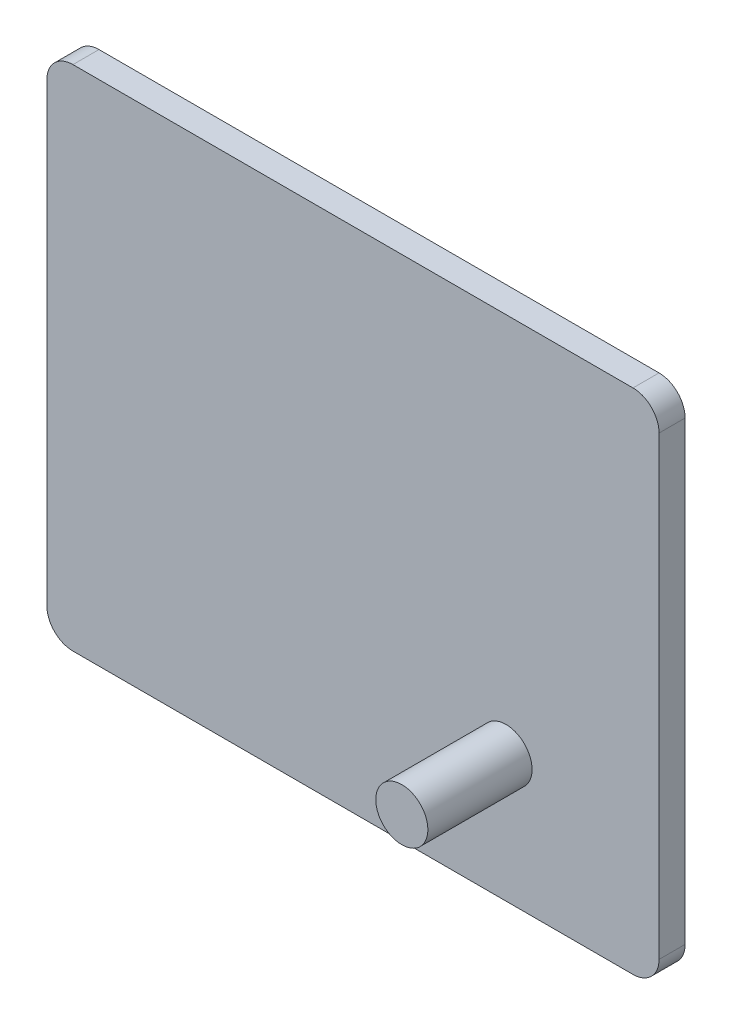
ISO-10303-21;
HEADER;
FILE_DESCRIPTION(('STEP AP214'),'2;1');
FILE_NAME('part.step','',(''),(''),'','','');
FILE_SCHEMA(('AUTOMOTIVE_DESIGN { 1 0 10303 214 1 1 1 1 }'));
ENDSEC;
DATA;
#1=APPLICATION_CONTEXT('core data for automotive mechanical design processes');
#2=APPLICATION_PROTOCOL_DEFINITION('international standard','automotive_design',2000,#1);
#3=PRODUCT_CONTEXT('',#1,'mechanical');
#4=PRODUCT('Part','Part','',(#3));
#5=PRODUCT_RELATED_PRODUCT_CATEGORY('part','',(#4));
#6=PRODUCT_DEFINITION_FORMATION('','',#4);
#7=PRODUCT_DEFINITION_CONTEXT('part definition',#1,'design');
#8=PRODUCT_DEFINITION('design','',#6,#7);
#9=PRODUCT_DEFINITION_SHAPE('','',#8);
#10=(LENGTH_UNIT() NAMED_UNIT(*) SI_UNIT(.MILLI.,.METRE.));
#11=(NAMED_UNIT(*) PLANE_ANGLE_UNIT() SI_UNIT($,.RADIAN.));
#12=(NAMED_UNIT(*) SI_UNIT($,.STERADIAN.) SOLID_ANGLE_UNIT());
#13=UNCERTAINTY_MEASURE_WITH_UNIT(LENGTH_MEASURE(1.E-05),#10,'distance_accuracy_value','');
#14=(GEOMETRIC_REPRESENTATION_CONTEXT(3) GLOBAL_UNCERTAINTY_ASSIGNED_CONTEXT((#13)) GLOBAL_UNIT_ASSIGNED_CONTEXT((#10,
#11,#12)) REPRESENTATION_CONTEXT('',''));
#15=CARTESIAN_POINT('',(0.,0.,0.));
#16=DIRECTION('',(0.,0.,1.));
#17=DIRECTION('',(1.,0.,0.));
#18=AXIS2_PLACEMENT_3D('',#15,#16,#17);
#19=CARTESIAN_POINT('',(0.,0.,13.5));
#20=DIRECTION('',(0.,0.,1.));
#21=DIRECTION('',(1.,0.,0.));
#22=AXIS2_PLACEMENT_3D('',#19,#20,#21);
#23=PLANE('',#22);
#24=DIRECTION('',(-1.,0.,0.));
#25=VECTOR('',#24,1.);
#26=CARTESIAN_POINT('',(5.375,4.875,13.5));
#27=LINE('',#26,#25);
#28=CARTESIAN_POINT('',(5.375,4.875,13.5));
#29=VERTEX_POINT('',#28);
#30=CARTESIAN_POINT('',(-5.375,4.875,13.5));
#31=VERTEX_POINT('',#30);
#32=EDGE_CURVE('E26',#29,#31,#27,.T.);
#33=ORIENTED_EDGE('',*,*,#32,.F.);
#34=CARTESIAN_POINT('',(5.375,4.375,13.5));
#35=DIRECTION('',(0.,0.,1.));
#36=DIRECTION('',(1.,0.,0.));
#37=AXIS2_PLACEMENT_3D('',#34,#35,#36);
#38=CIRCLE('',#37,0.5);
#39=CARTESIAN_POINT('',(5.875,4.375,13.5));
#40=VERTEX_POINT('',#39);
#41=EDGE_CURVE('E142',#40,#29,#38,.T.);
#42=ORIENTED_EDGE('',*,*,#41,.F.);
#43=DIRECTION('',(0.,1.,0.));
#44=VECTOR('',#43,1.);
#45=CARTESIAN_POINT('',(5.875,-4.375,13.5));
#46=LINE('',#45,#44);
#47=CARTESIAN_POINT('',(5.875,-4.375,13.5));
#48=VERTEX_POINT('',#47);
#49=EDGE_CURVE('E123',#48,#40,#46,.T.);
#50=ORIENTED_EDGE('',*,*,#49,.F.);
#51=CARTESIAN_POINT('',(5.375,-4.375,13.5));
#52=DIRECTION('',(0.,0.,1.));
#53=DIRECTION('',(0.,-1.,0.));
#54=AXIS2_PLACEMENT_3D('',#51,#52,#53);
#55=CIRCLE('',#54,0.5);
#56=CARTESIAN_POINT('',(5.375,-4.875,13.5));
#57=VERTEX_POINT('',#56);
#58=EDGE_CURVE('E163',#57,#48,#55,.T.);
#59=ORIENTED_EDGE('',*,*,#58,.F.);
#60=DIRECTION('',(1.,0.,0.));
#61=VECTOR('',#60,1.);
#62=CARTESIAN_POINT('',(-5.375,-4.875,13.5));
#63=LINE('',#62,#61);
#64=CARTESIAN_POINT('',(-5.375,-4.875,13.5));
#65=VERTEX_POINT('',#64);
#66=EDGE_CURVE('E159',#65,#57,#63,.T.);
#67=ORIENTED_EDGE('',*,*,#66,.F.);
#68=CARTESIAN_POINT('',(-5.375,-4.375,13.5));
#69=DIRECTION('',(0.,0.,1.));
#70=DIRECTION('',(-1.,0.,0.));
#71=AXIS2_PLACEMENT_3D('',#68,#69,#70);
#72=CIRCLE('',#71,0.5);
#73=CARTESIAN_POINT('',(-5.875,-4.375,13.5));
#74=VERTEX_POINT('',#73);
#75=EDGE_CURVE('E153',#74,#65,#72,.T.);
#76=ORIENTED_EDGE('',*,*,#75,.F.);
#77=DIRECTION('',(0.,-1.,0.));
#78=VECTOR('',#77,1.);
#79=CARTESIAN_POINT('',(-5.875,4.375,13.5));
#80=LINE('',#79,#78);
#81=CARTESIAN_POINT('',(-5.875,4.375,13.5));
#82=VERTEX_POINT('',#81);
#83=EDGE_CURVE('E174',#82,#74,#80,.T.);
#84=ORIENTED_EDGE('',*,*,#83,.F.);
#85=CARTESIAN_POINT('',(-5.375,4.375,13.5));
#86=DIRECTION('',(0.,0.,1.));
#87=DIRECTION('',(0.,1.,0.));
#88=AXIS2_PLACEMENT_3D('',#85,#86,#87);
#89=CIRCLE('',#88,0.5);
#90=EDGE_CURVE('E409',#31,#82,#89,.T.);
#91=ORIENTED_EDGE('',*,*,#90,.F.);
#92=EDGE_LOOP('',(#33,#42,#50,#59,#67,#76,#84,#91));
#93=FACE_BOUND('',#92,.T.);
#94=ADVANCED_FACE('F16',(#93),#23,.F.);
#95=CARTESIAN_POINT('',(0.,0.,14.));
#96=DIRECTION('',(0.,0.,1.));
#97=DIRECTION('',(1.,0.,0.));
#98=AXIS2_PLACEMENT_3D('',#95,#96,#97);
#99=PLANE('',#98);
#100=CARTESIAN_POINT('',(2.9375,-2.4375,14.));
#101=DIRECTION('',(0.,0.,-1.));
#102=DIRECTION('',(1.,0.,0.));
#103=AXIS2_PLACEMENT_3D('',#100,#101,#102);
#104=CIRCLE('',#103,0.5);
#105=CARTESIAN_POINT('',(3.4375,-2.4375,14.));
#106=VERTEX_POINT('',#105);
#107=CARTESIAN_POINT('',(2.4375,-2.4375,14.));
#108=VERTEX_POINT('',#107);
#109=EDGE_CURVE('E362',#106,#108,#104,.T.);
#110=ORIENTED_EDGE('',*,*,#109,.T.);
#111=CARTESIAN_POINT('',(2.9375,-2.4375,14.));
#112=DIRECTION('',(0.,0.,-1.));
#113=DIRECTION('',(1.,0.,0.));
#114=AXIS2_PLACEMENT_3D('',#111,#112,#113);
#115=CIRCLE('',#114,0.5);
#116=EDGE_CURVE('E146',#108,#106,#115,.T.);
#117=ORIENTED_EDGE('',*,*,#116,.T.);
#118=EDGE_LOOP('',(#110,#117));
#119=FACE_BOUND('',#118,.T.);
#120=DIRECTION('',(-1.,0.,0.));
#121=VECTOR('',#120,1.);
#122=CARTESIAN_POINT('',(5.375,4.875,14.));
#123=LINE('',#122,#121);
#124=CARTESIAN_POINT('',(5.375,4.875,14.));
#125=VERTEX_POINT('',#124);
#126=CARTESIAN_POINT('',(-5.375,4.875,14.));
#127=VERTEX_POINT('',#126);
#128=EDGE_CURVE('E11',#125,#127,#123,.T.);
#129=ORIENTED_EDGE('',*,*,#128,.T.);
#130=CARTESIAN_POINT('',(-5.375,4.375,14.));
#131=DIRECTION('',(0.,0.,1.));
#132=DIRECTION('',(0.,1.,0.));
#133=AXIS2_PLACEMENT_3D('',#130,#131,#132);
#134=CIRCLE('',#133,0.5);
#135=CARTESIAN_POINT('',(-5.875,4.375,14.));
#136=VERTEX_POINT('',#135);
#137=EDGE_CURVE('E396',#127,#136,#134,.T.);
#138=ORIENTED_EDGE('',*,*,#137,.T.);
#139=DIRECTION('',(0.,-1.,0.));
#140=VECTOR('',#139,1.);
#141=CARTESIAN_POINT('',(-5.875,4.375,14.));
#142=LINE('',#141,#140);
#143=CARTESIAN_POINT('',(-5.875,-4.375,14.));
#144=VERTEX_POINT('',#143);
#145=EDGE_CURVE('E19',#136,#144,#142,.T.);
#146=ORIENTED_EDGE('',*,*,#145,.T.);
#147=CARTESIAN_POINT('',(-5.375,-4.375,14.));
#148=DIRECTION('',(0.,0.,1.));
#149=DIRECTION('',(-1.,0.,0.));
#150=AXIS2_PLACEMENT_3D('',#147,#148,#149);
#151=CIRCLE('',#150,0.5);
#152=CARTESIAN_POINT('',(-5.375,-4.875,14.));
#153=VERTEX_POINT('',#152);
#154=EDGE_CURVE('E150',#144,#153,#151,.T.);
#155=ORIENTED_EDGE('',*,*,#154,.T.);
#156=DIRECTION('',(1.,0.,0.));
#157=VECTOR('',#156,1.);
#158=CARTESIAN_POINT('',(-5.375,-4.875,14.));
#159=LINE('',#158,#157);
#160=CARTESIAN_POINT('',(5.375,-4.875,14.));
#161=VERTEX_POINT('',#160);
#162=EDGE_CURVE('E155',#153,#161,#159,.T.);
#163=ORIENTED_EDGE('',*,*,#162,.T.);
#164=CARTESIAN_POINT('',(5.375,-4.375,14.));
#165=DIRECTION('',(0.,0.,1.));
#166=DIRECTION('',(0.,-1.,0.));
#167=AXIS2_PLACEMENT_3D('',#164,#165,#166);
#168=CIRCLE('',#167,0.5);
#169=CARTESIAN_POINT('',(5.875,-4.375,14.));
#170=VERTEX_POINT('',#169);
#171=EDGE_CURVE('E117',#161,#170,#168,.T.);
#172=ORIENTED_EDGE('',*,*,#171,.T.);
#173=DIRECTION('',(0.,1.,0.));
#174=VECTOR('',#173,1.);
#175=CARTESIAN_POINT('',(5.875,-4.375,14.));
#176=LINE('',#175,#174);
#177=CARTESIAN_POINT('',(5.875,4.375,14.));
#178=VERTEX_POINT('',#177);
#179=EDGE_CURVE('E110',#170,#178,#176,.T.);
#180=ORIENTED_EDGE('',*,*,#179,.T.);
#181=CARTESIAN_POINT('',(5.375,4.375,14.));
#182=DIRECTION('',(0.,0.,1.));
#183=DIRECTION('',(1.,0.,0.));
#184=AXIS2_PLACEMENT_3D('',#181,#182,#183);
#185=CIRCLE('',#184,0.5);
#186=EDGE_CURVE('E114',#178,#125,#185,.T.);
#187=ORIENTED_EDGE('',*,*,#186,.T.);
#188=EDGE_LOOP('',(#129,#138,#146,#155,#163,#172,#180,#187));
#189=FACE_BOUND('',#188,.T.);
#190=ADVANCED_FACE('F112',(#119,#189),#99,.T.);
#191=CARTESIAN_POINT('',(5.375,4.875,13.5));
#192=DIRECTION('',(0.,1.,0.));
#193=DIRECTION('',(1.,0.,0.));
#194=AXIS2_PLACEMENT_3D('',#191,#192,#193);
#195=PLANE('',#194);
#196=ORIENTED_EDGE('',*,*,#32,.T.);
#197=DIRECTION('',(0.,0.,1.));
#198=VECTOR('',#197,1.);
#199=CARTESIAN_POINT('',(-5.375,4.875,13.5));
#200=LINE('',#199,#198);
#201=EDGE_CURVE('E149',#31,#127,#200,.T.);
#202=ORIENTED_EDGE('',*,*,#201,.T.);
#203=ORIENTED_EDGE('',*,*,#128,.F.);
#204=DIRECTION('',(0.,0.,1.));
#205=VECTOR('',#204,1.);
#206=CARTESIAN_POINT('',(5.375,4.875,13.5));
#207=LINE('',#206,#205);
#208=EDGE_CURVE('E135',#29,#125,#207,.T.);
#209=ORIENTED_EDGE('',*,*,#208,.F.);
#210=EDGE_LOOP('',(#196,#202,#203,#209));
#211=FACE_BOUND('',#210,.T.);
#212=ADVANCED_FACE('F188',(#211),#195,.T.);
#213=CARTESIAN_POINT('',(-5.375,4.375,13.5));
#214=DIRECTION('',(0.,0.,1.));
#215=DIRECTION('',(0.,1.,0.));
#216=AXIS2_PLACEMENT_3D('',#213,#214,#215);
#217=CYLINDRICAL_SURFACE('',#216,0.5);
#218=ORIENTED_EDGE('',*,*,#90,.T.);
#219=DIRECTION('',(0.,0.,1.));
#220=VECTOR('',#219,1.);
#221=CARTESIAN_POINT('',(-5.875,4.375,13.5));
#222=LINE('',#221,#220);
#223=EDGE_CURVE('E173',#82,#136,#222,.T.);
#224=ORIENTED_EDGE('',*,*,#223,.T.);
#225=ORIENTED_EDGE('',*,*,#137,.F.);
#226=ORIENTED_EDGE('',*,*,#201,.F.);
#227=EDGE_LOOP('',(#218,#224,#225,#226));
#228=FACE_BOUND('',#227,.T.);
#229=ADVANCED_FACE('F193',(#228),#217,.T.);
#230=CARTESIAN_POINT('',(-5.875,4.375,13.5));
#231=DIRECTION('',(-1.,0.,0.));
#232=DIRECTION('',(0.,0.,1.));
#233=AXIS2_PLACEMENT_3D('',#230,#231,#232);
#234=PLANE('',#233);
#235=ORIENTED_EDGE('',*,*,#83,.T.);
#236=DIRECTION('',(0.,0.,1.));
#237=VECTOR('',#236,1.);
#238=CARTESIAN_POINT('',(-5.875,-4.375,13.5));
#239=LINE('',#238,#237);
#240=EDGE_CURVE('E152',#74,#144,#239,.T.);
#241=ORIENTED_EDGE('',*,*,#240,.T.);
#242=ORIENTED_EDGE('',*,*,#145,.F.);
#243=ORIENTED_EDGE('',*,*,#223,.F.);
#244=EDGE_LOOP('',(#235,#241,#242,#243));
#245=FACE_BOUND('',#244,.T.);
#246=ADVANCED_FACE('F243',(#245),#234,.T.);
#247=CARTESIAN_POINT('',(-5.375,-4.375,13.5));
#248=DIRECTION('',(0.,0.,1.));
#249=DIRECTION('',(-1.,0.,0.));
#250=AXIS2_PLACEMENT_3D('',#247,#248,#249);
#251=CYLINDRICAL_SURFACE('',#250,0.5);
#252=ORIENTED_EDGE('',*,*,#75,.T.);
#253=DIRECTION('',(0.,0.,1.));
#254=VECTOR('',#253,1.);
#255=CARTESIAN_POINT('',(-5.375,-4.875,13.5));
#256=LINE('',#255,#254);
#257=EDGE_CURVE('E158',#65,#153,#256,.T.);
#258=ORIENTED_EDGE('',*,*,#257,.T.);
#259=ORIENTED_EDGE('',*,*,#154,.F.);
#260=ORIENTED_EDGE('',*,*,#240,.F.);
#261=EDGE_LOOP('',(#252,#258,#259,#260));
#262=FACE_BOUND('',#261,.T.);
#263=ADVANCED_FACE('F235',(#262),#251,.T.);
#264=CARTESIAN_POINT('',(-5.375,-4.875,13.5));
#265=DIRECTION('',(0.,-1.,0.));
#266=DIRECTION('',(0.,0.,-1.));
#267=AXIS2_PLACEMENT_3D('',#264,#265,#266);
#268=PLANE('',#267);
#269=ORIENTED_EDGE('',*,*,#66,.T.);
#270=DIRECTION('',(0.,0.,1.));
#271=VECTOR('',#270,1.);
#272=CARTESIAN_POINT('',(5.375,-4.875,13.5));
#273=LINE('',#272,#271);
#274=EDGE_CURVE('E162',#57,#161,#273,.T.);
#275=ORIENTED_EDGE('',*,*,#274,.T.);
#276=ORIENTED_EDGE('',*,*,#162,.F.);
#277=ORIENTED_EDGE('',*,*,#257,.F.);
#278=EDGE_LOOP('',(#269,#275,#276,#277));
#279=FACE_BOUND('',#278,.T.);
#280=ADVANCED_FACE('F219',(#279),#268,.T.);
#281=CARTESIAN_POINT('',(5.375,-4.375,13.5));
#282=DIRECTION('',(0.,0.,1.));
#283=DIRECTION('',(0.,-1.,0.));
#284=AXIS2_PLACEMENT_3D('',#281,#282,#283);
#285=CYLINDRICAL_SURFACE('',#284,0.5);
#286=ORIENTED_EDGE('',*,*,#58,.T.);
#287=DIRECTION('',(0.,0.,1.));
#288=VECTOR('',#287,1.);
#289=CARTESIAN_POINT('',(5.875,-4.375,13.5));
#290=LINE('',#289,#288);
#291=EDGE_CURVE('E122',#48,#170,#290,.T.);
#292=ORIENTED_EDGE('',*,*,#291,.T.);
#293=ORIENTED_EDGE('',*,*,#171,.F.);
#294=ORIENTED_EDGE('',*,*,#274,.F.);
#295=EDGE_LOOP('',(#286,#292,#293,#294));
#296=FACE_BOUND('',#295,.T.);
#297=ADVANCED_FACE('F203',(#296),#285,.T.);
#298=CARTESIAN_POINT('',(5.875,-4.375,13.5));
#299=DIRECTION('',(1.,0.,0.));
#300=DIRECTION('',(0.,1.,0.));
#301=AXIS2_PLACEMENT_3D('',#298,#299,#300);
#302=PLANE('',#301);
#303=ORIENTED_EDGE('',*,*,#49,.T.);
#304=DIRECTION('',(0.,0.,1.));
#305=VECTOR('',#304,1.);
#306=CARTESIAN_POINT('',(5.875,4.375,13.5));
#307=LINE('',#306,#305);
#308=EDGE_CURVE('E125',#40,#178,#307,.T.);
#309=ORIENTED_EDGE('',*,*,#308,.T.);
#310=ORIENTED_EDGE('',*,*,#179,.F.);
#311=ORIENTED_EDGE('',*,*,#291,.F.);
#312=EDGE_LOOP('',(#303,#309,#310,#311));
#313=FACE_BOUND('',#312,.T.);
#314=ADVANCED_FACE('F126',(#313),#302,.T.);
#315=CARTESIAN_POINT('',(5.375,4.375,13.5));
#316=DIRECTION('',(0.,0.,1.));
#317=DIRECTION('',(1.,0.,0.));
#318=AXIS2_PLACEMENT_3D('',#315,#316,#317);
#319=CYLINDRICAL_SURFACE('',#318,0.5);
#320=ORIENTED_EDGE('',*,*,#41,.T.);
#321=ORIENTED_EDGE('',*,*,#208,.T.);
#322=ORIENTED_EDGE('',*,*,#186,.F.);
#323=ORIENTED_EDGE('',*,*,#308,.F.);
#324=EDGE_LOOP('',(#320,#321,#322,#323));
#325=FACE_BOUND('',#324,.T.);
#326=ADVANCED_FACE('F133',(#325),#319,.T.);
#327=CARTESIAN_POINT('',(2.9375,-2.4375,16.));
#328=DIRECTION('',(0.,0.,1.));
#329=DIRECTION('',(1.,0.,0.));
#330=AXIS2_PLACEMENT_3D('',#327,#328,#329);
#331=PLANE('',#330);
#332=CARTESIAN_POINT('',(2.9375,-2.4375,16.));
#333=DIRECTION('',(0.,0.,1.));
#334=DIRECTION('',(1.,0.,0.));
#335=AXIS2_PLACEMENT_3D('',#332,#333,#334);
#336=CIRCLE('',#335,0.5);
#337=CARTESIAN_POINT('',(3.4375,-2.4375,16.));
#338=VERTEX_POINT('',#337);
#339=CARTESIAN_POINT('',(2.4375,-2.4375,16.));
#340=VERTEX_POINT('',#339);
#341=EDGE_CURVE('E415',#338,#340,#336,.T.);
#342=ORIENTED_EDGE('',*,*,#341,.T.);
#343=CARTESIAN_POINT('',(2.9375,-2.4375,16.));
#344=DIRECTION('',(0.,0.,1.));
#345=DIRECTION('',(1.,0.,0.));
#346=AXIS2_PLACEMENT_3D('',#343,#344,#345);
#347=CIRCLE('',#346,0.5);
#348=EDGE_CURVE('E372',#340,#338,#347,.T.);
#349=ORIENTED_EDGE('',*,*,#348,.T.);
#350=EDGE_LOOP('',(#342,#349));
#351=FACE_BOUND('',#350,.T.);
#352=ADVANCED_FACE('F175',(#351),#331,.T.);
#353=CARTESIAN_POINT('',(2.9375,-2.4375,14.));
#354=DIRECTION('',(0.,0.,1.));
#355=DIRECTION('',(1.,0.,0.));
#356=AXIS2_PLACEMENT_3D('',#353,#354,#355);
#357=CYLINDRICAL_SURFACE('',#356,0.5);
#358=ORIENTED_EDGE('',*,*,#341,.F.);
#359=ORIENTED_EDGE('',*,*,#348,.F.);
#360=DIRECTION('',(0.,0.,-1.));
#361=VECTOR('',#360,1.);
#362=CARTESIAN_POINT('',(2.4375,-2.4375,14.));
#363=LINE('',#362,#361);
#364=EDGE_CURVE('E366',#340,#108,#363,.T.);
#365=ORIENTED_EDGE('',*,*,#364,.T.);
#366=ORIENTED_EDGE('',*,*,#109,.F.);
#367=ORIENTED_EDGE('',*,*,#116,.F.);
#368=ORIENTED_EDGE('',*,*,#364,.F.);
#369=EDGE_LOOP('',(#358,#359,#365,#366,#367,#368));
#370=FACE_BOUND('',#369,.T.);
#371=ADVANCED_FACE('F180',(#370),#357,.T.);
#372=CLOSED_SHELL('',(#94,#190,#212,#229,#246,#263,#280,#297,#314,#326,#352,#371));
#373=MANIFOLD_SOLID_BREP('B1',#372);
#374=ADVANCED_BREP_SHAPE_REPRESENTATION('',(#18,#373),#14);
#375=SHAPE_DEFINITION_REPRESENTATION(#9,#374);
ENDSEC;
END-ISO-10303-21;
